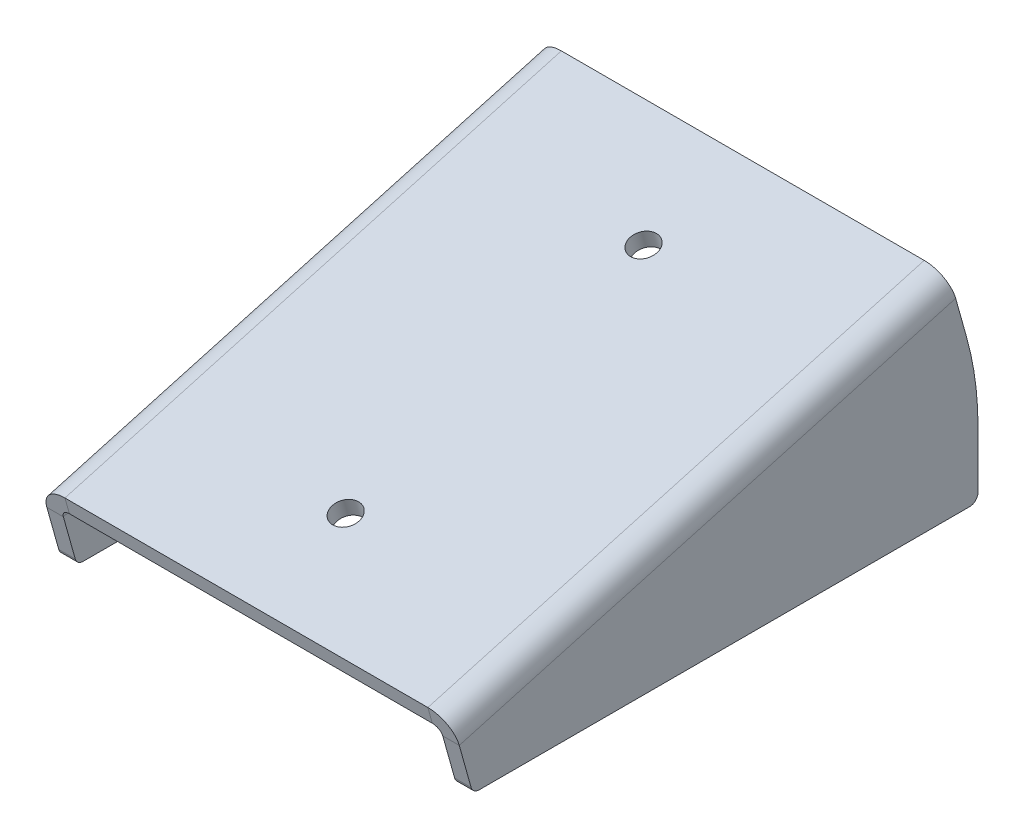
ISO-10303-21;
HEADER;
FILE_DESCRIPTION(('STEP AP214'),'2;1');
FILE_NAME('part.step','',(''),(''),'','','');
FILE_SCHEMA(('AUTOMOTIVE_DESIGN { 1 0 10303 214 1 1 1 1 }'));
ENDSEC;
DATA;
#1=APPLICATION_CONTEXT('core data for automotive mechanical design processes');
#2=APPLICATION_PROTOCOL_DEFINITION('international standard','automotive_design',2000,#1);
#3=PRODUCT_CONTEXT('',#1,'mechanical');
#4=PRODUCT('Part','Part','',(#3));
#5=PRODUCT_RELATED_PRODUCT_CATEGORY('part','',(#4));
#6=PRODUCT_DEFINITION_FORMATION('','',#4);
#7=PRODUCT_DEFINITION_CONTEXT('part definition',#1,'design');
#8=PRODUCT_DEFINITION('design','',#6,#7);
#9=PRODUCT_DEFINITION_SHAPE('','',#8);
#10=(LENGTH_UNIT() NAMED_UNIT(*) SI_UNIT(.MILLI.,.METRE.));
#11=(NAMED_UNIT(*) PLANE_ANGLE_UNIT() SI_UNIT($,.RADIAN.));
#12=(NAMED_UNIT(*) SI_UNIT($,.STERADIAN.) SOLID_ANGLE_UNIT());
#13=UNCERTAINTY_MEASURE_WITH_UNIT(LENGTH_MEASURE(1.E-05),#10,'distance_accuracy_value','');
#14=(GEOMETRIC_REPRESENTATION_CONTEXT(3) GLOBAL_UNCERTAINTY_ASSIGNED_CONTEXT((#13)) GLOBAL_UNIT_ASSIGNED_CONTEXT((#10,
#11,#12)) REPRESENTATION_CONTEXT('',''));
#15=CARTESIAN_POINT('',(0.,0.,0.));
#16=DIRECTION('',(0.,0.,1.));
#17=DIRECTION('',(1.,0.,0.));
#18=AXIS2_PLACEMENT_3D('',#15,#16,#17);
#19=CARTESIAN_POINT('',(50.,13.6740890799414,126.328819016498));
#20=DIRECTION('',(0.,-0.269629925519971,0.962964019714182));
#21=DIRECTION('',(1.,0.,0.));
#22=AXIS2_PLACEMENT_3D('',#19,#20,#21);
#23=PLANE('',#22);
#24=DIRECTION('',(0.,-0.962964019714182,-0.269629925519971));
#25=VECTOR('',#24,1.);
#26=CARTESIAN_POINT('',(44.,13.6740890799414,126.328819016498));
#27=LINE('',#26,#25);
#28=CARTESIAN_POINT('',(44.,17.5259451587981,127.407338718578));
#29=VERTEX_POINT('',#28);
#30=CARTESIAN_POINT('',(44.,13.6740890799414,126.328819016498));
#31=VERTEX_POINT('',#30);
#32=EDGE_CURVE('E290',#29,#31,#27,.T.);
#33=ORIENTED_EDGE('',*,*,#32,.F.);
#34=DIRECTION('',(1.,0.,0.));
#35=VECTOR('',#34,1.);
#36=CARTESIAN_POINT('',(-46.,17.5259451587981,127.407338718578));
#37=LINE('',#36,#35);
#38=CARTESIAN_POINT('',(-44.,17.5259451587981,127.407338718578));
#39=VERTEX_POINT('',#38);
#40=EDGE_CURVE('E260',#39,#29,#37,.T.);
#41=ORIENTED_EDGE('',*,*,#40,.F.);
#42=DIRECTION('',(0.,-0.962964019714182,-0.269629925519971));
#43=VECTOR('',#42,1.);
#44=CARTESIAN_POINT('',(-44.,13.6740890799414,126.328819016498));
#45=LINE('',#44,#43);
#46=CARTESIAN_POINT('',(-44.,13.6740890799414,126.328819016498));
#47=VERTEX_POINT('',#46);
#48=EDGE_CURVE('E288',#39,#47,#45,.T.);
#49=ORIENTED_EDGE('',*,*,#48,.T.);
#50=DIRECTION('',(1.,0.,0.));
#51=VECTOR('',#50,1.);
#52=CARTESIAN_POINT('',(50.,13.6740890799414,126.328819016498));
#53=LINE('',#52,#51);
#54=EDGE_CURVE('E620',#47,#31,#53,.T.);
#55=ORIENTED_EDGE('',*,*,#54,.T.);
#56=EDGE_LOOP('',(#33,#41,#49,#55));
#57=FACE_BOUND('',#56,.T.);
#58=ADVANCED_FACE('F39',(#57),#23,.T.);
#59=CARTESIAN_POINT('',(-44.,11.748161040513,125.789559165458));
#60=DIRECTION('',(0.,-0.26962992551997,0.962964019714182));
#61=DIRECTION('',(0.,-0.962964019714182,-0.26962992551997));
#62=AXIS2_PLACEMENT_3D('',#59,#60,#61);
#63=PLANE('',#62);
#64=ORIENTED_EDGE('',*,*,#48,.F.);
#65=CARTESIAN_POINT('',(-44.,11.748161040513,125.789559165458));
#66=DIRECTION('',(0.,-0.269629925519971,0.962964019714182));
#67=DIRECTION('',(0.,-0.962964019714182,-0.269629925519971));
#68=AXIS2_PLACEMENT_3D('',#65,#66,#67);
#69=CIRCLE('',#68,6.);
#70=CARTESIAN_POINT('',(-50.,11.748161040513,125.789559165458));
#71=VERTEX_POINT('',#70);
#72=EDGE_CURVE('E256',#39,#71,#69,.T.);
#73=ORIENTED_EDGE('',*,*,#72,.T.);
#74=DIRECTION('',(1.,0.,0.));
#75=VECTOR('',#74,1.);
#76=CARTESIAN_POINT('',(-46.,11.748161040513,125.789559165458));
#77=LINE('',#76,#75);
#78=CARTESIAN_POINT('',(-46.,11.748161040513,125.789559165458));
#79=VERTEX_POINT('',#78);
#80=EDGE_CURVE('E285',#71,#79,#77,.T.);
#81=ORIENTED_EDGE('',*,*,#80,.T.);
#82=CARTESIAN_POINT('',(-44.,11.748161040513,125.789559165458));
#83=DIRECTION('',(0.,0.26962992551997,-0.962964019714182));
#84=DIRECTION('',(0.,0.962964019714182,0.26962992551997));
#85=AXIS2_PLACEMENT_3D('',#82,#83,#84);
#86=CIRCLE('',#85,2.);
#87=EDGE_CURVE('E199',#47,#79,#86,.F.);
#88=ORIENTED_EDGE('',*,*,#87,.F.);
#89=EDGE_LOOP('',(#64,#73,#81,#88));
#90=FACE_BOUND('',#89,.T.);
#91=ADVANCED_FACE('F412',(#90),#63,.T.);
#92=CARTESIAN_POINT('',(-46.,17.5259451587981,127.407338718578));
#93=DIRECTION('',(0.,-0.26962992551997,0.962964019714182));
#94=DIRECTION('',(0.,0.962964019714182,0.26962992551997));
#95=AXIS2_PLACEMENT_3D('',#92,#93,#94);
#96=PLANE('',#95);
#97=DIRECTION('',(0.,0.962964019714182,0.26962992551997));
#98=VECTOR('',#97,1.);
#99=CARTESIAN_POINT('',(-50.,17.5259451587981,127.407338718578));
#100=LINE('',#99,#98);
#101=CARTESIAN_POINT('',(-50.,1.46074014896006,122.909081315824));
#102=VERTEX_POINT('',#101);
#103=EDGE_CURVE('E253',#102,#71,#100,.T.);
#104=ORIENTED_EDGE('',*,*,#103,.F.);
#105=DIRECTION('',(1.,0.,0.));
#106=VECTOR('',#105,1.);
#107=CARTESIAN_POINT('',(-46.,1.46074014896006,122.909081315824));
#108=LINE('',#107,#106);
#109=CARTESIAN_POINT('',(-46.,1.46074014896006,122.909081315824));
#110=VERTEX_POINT('',#109);
#111=EDGE_CURVE('E326',#102,#110,#108,.T.);
#112=ORIENTED_EDGE('',*,*,#111,.T.);
#113=DIRECTION('',(0.,0.962964019714182,0.26962992551997));
#114=VECTOR('',#113,1.);
#115=CARTESIAN_POINT('',(-46.,17.5259451587981,127.407338718578));
#116=LINE('',#115,#114);
#117=EDGE_CURVE('E207',#110,#79,#116,.T.);
#118=ORIENTED_EDGE('',*,*,#117,.T.);
#119=ORIENTED_EDGE('',*,*,#80,.F.);
#120=EDGE_LOOP('',(#104,#112,#118,#119));
#121=FACE_BOUND('',#120,.T.);
#122=ADVANCED_FACE('F418',(#121),#96,.T.);
#123=CARTESIAN_POINT('',(-46.,0.,0.));
#124=DIRECTION('',(0.,-1.,0.));
#125=DIRECTION('',(0.,0.,1.));
#126=AXIS2_PLACEMENT_3D('',#123,#124,#125);
#127=PLANE('',#126);
#128=DIRECTION('',(0.,0.,1.));
#129=VECTOR('',#128,1.);
#130=CARTESIAN_POINT('',(-50.,0.,130.879324065148));
#131=LINE('',#130,#129);
#132=CARTESIAN_POINT('',(-50.,0.,2.));
#133=VERTEX_POINT('',#132);
#134=CARTESIAN_POINT('',(-50.,0.,120.983153276395));
#135=VERTEX_POINT('',#134);
#136=EDGE_CURVE('E270',#133,#135,#131,.T.);
#137=ORIENTED_EDGE('',*,*,#136,.F.);
#138=DIRECTION('',(1.,0.,0.));
#139=VECTOR('',#138,1.);
#140=CARTESIAN_POINT('',(-46.,0.,2.));
#141=LINE('',#140,#139);
#142=CARTESIAN_POINT('',(-46.,0.,2.));
#143=VERTEX_POINT('',#142);
#144=EDGE_CURVE('E295',#133,#143,#141,.T.);
#145=ORIENTED_EDGE('',*,*,#144,.T.);
#146=DIRECTION('',(0.,0.,1.));
#147=VECTOR('',#146,1.);
#148=CARTESIAN_POINT('',(-46.,0.,0.));
#149=LINE('',#148,#147);
#150=CARTESIAN_POINT('',(-46.,0.,120.983153276395));
#151=VERTEX_POINT('',#150);
#152=EDGE_CURVE('E367',#143,#151,#149,.T.);
#153=ORIENTED_EDGE('',*,*,#152,.T.);
#154=DIRECTION('',(1.,0.,0.));
#155=VECTOR('',#154,1.);
#156=CARTESIAN_POINT('',(-46.,0.,120.983153276395));
#157=LINE('',#156,#155);
#158=EDGE_CURVE('E292',#151,#135,#157,.F.);
#159=ORIENTED_EDGE('',*,*,#158,.T.);
#160=EDGE_LOOP('',(#137,#145,#153,#159));
#161=FACE_BOUND('',#160,.T.);
#162=ADVANCED_FACE('F455',(#161),#127,.T.);
#163=CARTESIAN_POINT('',(-46.,26.0981277977035,0.));
#164=DIRECTION('',(0.,0.,-1.));
#165=DIRECTION('',(0.,-1.,0.));
#166=AXIS2_PLACEMENT_3D('',#163,#164,#165);
#167=PLANE('',#166);
#168=DIRECTION('',(0.,1.,0.));
#169=VECTOR('',#168,1.);
#170=CARTESIAN_POINT('',(-50.,12.3999476663196,0.));
#171=LINE('',#170,#169);
#172=CARTESIAN_POINT('',(-50.,15.7962352459784,0.));
#173=VERTEX_POINT('',#172);
#174=CARTESIAN_POINT('',(-50.,2.,0.));
#175=VERTEX_POINT('',#174);
#176=EDGE_CURVE('E268',#173,#175,#171,.F.);
#177=ORIENTED_EDGE('',*,*,#176,.F.);
#178=DIRECTION('',(1.,0.,0.));
#179=VECTOR('',#178,1.);
#180=CARTESIAN_POINT('',(-46.,15.7962352459784,0.));
#181=LINE('',#180,#179);
#182=CARTESIAN_POINT('',(-46.,15.7962352459784,0.));
#183=VERTEX_POINT('',#182);
#184=EDGE_CURVE('E331',#173,#183,#181,.T.);
#185=ORIENTED_EDGE('',*,*,#184,.T.);
#186=DIRECTION('',(0.,-1.,0.));
#187=VECTOR('',#186,1.);
#188=CARTESIAN_POINT('',(-46.,26.0981277977035,0.));
#189=LINE('',#188,#187);
#190=CARTESIAN_POINT('',(-46.,2.,0.));
#191=VERTEX_POINT('',#190);
#192=EDGE_CURVE('E362',#183,#191,#189,.T.);
#193=ORIENTED_EDGE('',*,*,#192,.T.);
#194=DIRECTION('',(1.,0.,0.));
#195=VECTOR('',#194,1.);
#196=CARTESIAN_POINT('',(-46.,2.,0.));
#197=LINE('',#196,#195);
#198=EDGE_CURVE('E303',#191,#175,#197,.F.);
#199=ORIENTED_EDGE('',*,*,#198,.T.);
#200=EDGE_LOOP('',(#177,#185,#193,#199));
#201=FACE_BOUND('',#200,.T.);
#202=ADVANCED_FACE('F351',(#201),#167,.T.);
#203=CARTESIAN_POINT('',(-46.,51.2296858487945,7.03683625430547));
#204=DIRECTION('',(0.,0.269629925519971,-0.962964019714182));
#205=DIRECTION('',(0.,-0.962964019714182,-0.269629925519971));
#206=AXIS2_PLACEMENT_3D('',#203,#204,#205);
#207=PLANE('',#206);
#208=DIRECTION('',(0.,-0.962964019714182,-0.269629925519971));
#209=VECTOR('',#208,1.);
#210=CARTESIAN_POINT('',(-46.,51.2296858487945,7.03683625430547));
#211=LINE('',#210,#209);
#212=CARTESIAN_POINT('',(-46.,45.4519017305094,5.41905670118565));
#213=VERTEX_POINT('',#212);
#214=CARTESIAN_POINT('',(-46.,36.0184796599762,2.77769852143637));
#215=VERTEX_POINT('',#214);
#216=EDGE_CURVE('E360',#213,#215,#211,.T.);
#217=ORIENTED_EDGE('',*,*,#216,.T.);
#218=DIRECTION('',(1.,0.,0.));
#219=VECTOR('',#218,1.);
#220=CARTESIAN_POINT('',(-46.,36.0184796599762,2.77769852143637));
#221=LINE('',#220,#219);
#222=CARTESIAN_POINT('',(-50.,36.0184796599762,2.77769852143637));
#223=VERTEX_POINT('',#222);
#224=EDGE_CURVE('E336',#215,#223,#221,.F.);
#225=ORIENTED_EDGE('',*,*,#224,.T.);
#226=DIRECTION('',(0.,-0.962964019714182,-0.269629925519971));
#227=VECTOR('',#226,1.);
#228=CARTESIAN_POINT('',(-50.,51.2296858487945,7.03683625430547));
#229=LINE('',#228,#227);
#230=CARTESIAN_POINT('',(-50.,45.4519017305094,5.41905670118564));
#231=VERTEX_POINT('',#230);
#232=EDGE_CURVE('E265',#231,#223,#229,.T.);
#233=ORIENTED_EDGE('',*,*,#232,.F.);
#234=DIRECTION('',(1.,0.,0.));
#235=VECTOR('',#234,1.);
#236=CARTESIAN_POINT('',(-46.,45.4519017305094,5.41905670118565));
#237=LINE('',#236,#235);
#238=EDGE_CURVE('E283',#231,#213,#237,.T.);
#239=ORIENTED_EDGE('',*,*,#238,.T.);
#240=EDGE_LOOP('',(#217,#225,#233,#239));
#241=FACE_BOUND('',#240,.T.);
#242=ADVANCED_FACE('F364',(#241),#207,.T.);
#243=CARTESIAN_POINT('',(-44.,45.4519017305094,5.41905670118563));
#244=DIRECTION('',(0.,-0.269629925519971,0.962964019714182));
#245=DIRECTION('',(0.,-0.962964019714182,-0.269629925519971));
#246=AXIS2_PLACEMENT_3D('',#243,#244,#245);
#247=PLANE('',#246);
#248=ORIENTED_EDGE('',*,*,#238,.F.);
#249=CARTESIAN_POINT('',(-44.,45.4519017305094,5.41905670118563));
#250=DIRECTION('',(0.,-0.269629925519971,0.962964019714182));
#251=DIRECTION('',(0.,-0.962964019714182,-0.269629925519971));
#252=AXIS2_PLACEMENT_3D('',#249,#250,#251);
#253=CIRCLE('',#252,6.);
#254=CARTESIAN_POINT('',(-44.,51.2296858487945,7.03683625430546));
#255=VERTEX_POINT('',#254);
#256=EDGE_CURVE('E261',#231,#255,#253,.F.);
#257=ORIENTED_EDGE('',*,*,#256,.T.);
#258=DIRECTION('',(0.,-0.962964019714182,-0.269629925519971));
#259=VECTOR('',#258,1.);
#260=CARTESIAN_POINT('',(-44.,47.3778297699377,5.95831655222559));
#261=LINE('',#260,#259);
#262=CARTESIAN_POINT('',(-44.,47.3778297699377,5.95831655222559));
#263=VERTEX_POINT('',#262);
#264=EDGE_CURVE('E281',#255,#263,#261,.T.);
#265=ORIENTED_EDGE('',*,*,#264,.T.);
#266=CARTESIAN_POINT('',(-44.,45.4519017305094,5.41905670118563));
#267=DIRECTION('',(0.,0.269629925519971,-0.962964019714182));
#268=DIRECTION('',(0.,0.962964019714182,0.269629925519971));
#269=AXIS2_PLACEMENT_3D('',#266,#267,#268);
#270=CIRCLE('',#269,2.);
#271=EDGE_CURVE('E227',#213,#263,#270,.T.);
#272=ORIENTED_EDGE('',*,*,#271,.F.);
#273=EDGE_LOOP('',(#248,#257,#265,#272));
#274=FACE_BOUND('',#273,.T.);
#275=ADVANCED_FACE('F467',(#274),#247,.F.);
#276=CARTESIAN_POINT('',(-46.,47.3778297699377,5.95831655222559));
#277=DIRECTION('',(0.,-0.269629925519971,0.962964019714182));
#278=DIRECTION('',(1.,0.,0.));
#279=AXIS2_PLACEMENT_3D('',#276,#277,#278);
#280=PLANE('',#279);
#281=ORIENTED_EDGE('',*,*,#264,.F.);
#282=DIRECTION('',(1.,0.,0.));
#283=VECTOR('',#282,1.);
#284=CARTESIAN_POINT('',(-46.,51.2296858487945,7.03683625430547));
#285=LINE('',#284,#283);
#286=CARTESIAN_POINT('',(44.,51.2296858487945,7.03683625430547));
#287=VERTEX_POINT('',#286);
#288=EDGE_CURVE('E257',#255,#287,#285,.T.);
#289=ORIENTED_EDGE('',*,*,#288,.T.);
#290=DIRECTION('',(0.,-0.962964019714179,-0.269629925519981));
#291=VECTOR('',#290,1.);
#292=CARTESIAN_POINT('',(44.,47.3778297699377,5.95831655222559));
#293=LINE('',#292,#291);
#294=CARTESIAN_POINT('',(44.,47.3778297699377,5.95831655222559));
#295=VERTEX_POINT('',#294);
#296=EDGE_CURVE('E187',#287,#295,#293,.T.);
#297=ORIENTED_EDGE('',*,*,#296,.T.);
#298=DIRECTION('',(1.,0.,0.));
#299=VECTOR('',#298,1.);
#300=CARTESIAN_POINT('',(-46.,47.3778297699377,5.95831655222559));
#301=LINE('',#300,#299);
#302=EDGE_CURVE('E221',#263,#295,#301,.T.);
#303=ORIENTED_EDGE('',*,*,#302,.F.);
#304=EDGE_LOOP('',(#281,#289,#297,#303));
#305=FACE_BOUND('',#304,.T.);
#306=ADVANCED_FACE('F599',(#305),#280,.F.);
#307=CARTESIAN_POINT('',(44.,45.4519017305094,5.41905670118563));
#308=DIRECTION('',(0.,0.269629925519971,-0.962964019714182));
#309=DIRECTION('',(0.,0.962964019714182,0.269629925519971));
#310=AXIS2_PLACEMENT_3D('',#307,#308,#309);
#311=PLANE('',#310);
#312=ORIENTED_EDGE('',*,*,#296,.F.);
#313=CARTESIAN_POINT('',(44.,45.4519017305094,5.41905670118563));
#314=DIRECTION('',(0.,-0.269629925519971,0.962964019714182));
#315=DIRECTION('',(0.,-0.962964019714182,-0.269629925519971));
#316=AXIS2_PLACEMENT_3D('',#313,#314,#315);
#317=CIRCLE('',#316,6.);
#318=CARTESIAN_POINT('',(50.,45.4519017305094,5.41905670118562));
#319=VERTEX_POINT('',#318);
#320=EDGE_CURVE('E182',#287,#319,#317,.F.);
#321=ORIENTED_EDGE('',*,*,#320,.T.);
#322=DIRECTION('',(-1.,0.,0.));
#323=VECTOR('',#322,1.);
#324=CARTESIAN_POINT('',(46.,45.4519017305094,5.41905670118565));
#325=LINE('',#324,#323);
#326=CARTESIAN_POINT('',(46.,45.4519017305094,5.41905670118565));
#327=VERTEX_POINT('',#326);
#328=EDGE_CURVE('E176',#319,#327,#325,.T.);
#329=ORIENTED_EDGE('',*,*,#328,.T.);
#330=CARTESIAN_POINT('',(44.,45.4519017305094,5.41905670118563));
#331=DIRECTION('',(0.,-0.269629925519971,0.962964019714182));
#332=DIRECTION('',(0.,-0.962964019714182,-0.269629925519971));
#333=AXIS2_PLACEMENT_3D('',#330,#331,#332);
#334=CIRCLE('',#333,2.);
#335=EDGE_CURVE('E179',#295,#327,#334,.F.);
#336=ORIENTED_EDGE('',*,*,#335,.F.);
#337=EDGE_LOOP('',(#312,#321,#329,#336));
#338=FACE_BOUND('',#337,.T.);
#339=ADVANCED_FACE('F178',(#338),#311,.T.);
#340=CARTESIAN_POINT('',(46.,47.3778297699377,5.95831655222559));
#341=DIRECTION('',(0.,-0.269629925519971,0.962964019714182));
#342=DIRECTION('',(0.,-0.962964019714182,-0.269629925519971));
#343=AXIS2_PLACEMENT_3D('',#340,#341,#342);
#344=PLANE('',#343);
#345=DIRECTION('',(0.,-0.962964019714182,-0.269629925519971));
#346=VECTOR('',#345,1.);
#347=CARTESIAN_POINT('',(50.,47.3778297699377,5.95831655222559));
#348=LINE('',#347,#346);
#349=CARTESIAN_POINT('',(50.,36.0184796599762,2.77769852143636));
#350=VERTEX_POINT('',#349);
#351=EDGE_CURVE('E251',#319,#350,#348,.T.);
#352=ORIENTED_EDGE('',*,*,#351,.T.);
#353=DIRECTION('',(-1.,0.,0.));
#354=VECTOR('',#353,1.);
#355=CARTESIAN_POINT('',(46.,36.0184796599762,2.77769852143636));
#356=LINE('',#355,#354);
#357=CARTESIAN_POINT('',(46.,36.0184796599762,2.77769852143636));
#358=VERTEX_POINT('',#357);
#359=EDGE_CURVE('E205',#350,#358,#356,.T.);
#360=ORIENTED_EDGE('',*,*,#359,.T.);
#361=DIRECTION('',(0.,-0.962964019714182,-0.269629925519971));
#362=VECTOR('',#361,1.);
#363=CARTESIAN_POINT('',(46.,47.3778297699377,5.95831655222559));
#364=LINE('',#363,#362);
#365=EDGE_CURVE('E202',#327,#358,#364,.T.);
#366=ORIENTED_EDGE('',*,*,#365,.F.);
#367=ORIENTED_EDGE('',*,*,#328,.F.);
#368=EDGE_LOOP('',(#352,#360,#366,#367));
#369=FACE_BOUND('',#368,.T.);
#370=ADVANCED_FACE('F203',(#369),#344,.F.);
#371=CARTESIAN_POINT('',(46.,26.0981277977035,0.));
#372=DIRECTION('',(0.,0.,-1.));
#373=DIRECTION('',(0.,1.,0.));
#374=AXIS2_PLACEMENT_3D('',#371,#372,#373);
#375=PLANE('',#374);
#376=DIRECTION('',(0.,1.,0.));
#377=VECTOR('',#376,1.);
#378=CARTESIAN_POINT('',(46.,26.0981277977035,0.));
#379=LINE('',#378,#377);
#380=CARTESIAN_POINT('',(46.,2.,0.));
#381=VERTEX_POINT('',#380);
#382=CARTESIAN_POINT('',(46.,15.7962352459784,0.));
#383=VERTEX_POINT('',#382);
#384=EDGE_CURVE('E206',#381,#383,#379,.T.);
#385=ORIENTED_EDGE('',*,*,#384,.T.);
#386=DIRECTION('',(1.,0.,0.));
#387=VECTOR('',#386,1.);
#388=CARTESIAN_POINT('',(46.,15.7962352459784,0.));
#389=LINE('',#388,#387);
#390=CARTESIAN_POINT('',(50.,15.7962352459784,0.));
#391=VERTEX_POINT('',#390);
#392=EDGE_CURVE('E47',#383,#391,#389,.T.);
#393=ORIENTED_EDGE('',*,*,#392,.T.);
#394=DIRECTION('',(0.,1.,0.));
#395=VECTOR('',#394,1.);
#396=CARTESIAN_POINT('',(50.,12.3999476663196,0.));
#397=LINE('',#396,#395);
#398=CARTESIAN_POINT('',(50.,2.,0.));
#399=VERTEX_POINT('',#398);
#400=EDGE_CURVE('E249',#399,#391,#397,.T.);
#401=ORIENTED_EDGE('',*,*,#400,.F.);
#402=DIRECTION('',(-1.,0.,0.));
#403=VECTOR('',#402,1.);
#404=CARTESIAN_POINT('',(46.,2.,0.));
#405=LINE('',#404,#403);
#406=EDGE_CURVE('E310',#399,#381,#405,.T.);
#407=ORIENTED_EDGE('',*,*,#406,.T.);
#408=EDGE_LOOP('',(#385,#393,#401,#407));
#409=FACE_BOUND('',#408,.T.);
#410=ADVANCED_FACE('F385',(#409),#375,.T.);
#411=CARTESIAN_POINT('',(46.,0.,0.));
#412=DIRECTION('',(0.,-1.,0.));
#413=DIRECTION('',(0.,0.,-1.));
#414=AXIS2_PLACEMENT_3D('',#411,#412,#413);
#415=PLANE('',#414);
#416=DIRECTION('',(0.,0.,-1.));
#417=VECTOR('',#416,1.);
#418=CARTESIAN_POINT('',(46.,0.,0.));
#419=LINE('',#418,#417);
#420=CARTESIAN_POINT('',(46.,0.,120.983153276395));
#421=VERTEX_POINT('',#420);
#422=CARTESIAN_POINT('',(46.,0.,2.));
#423=VERTEX_POINT('',#422);
#424=EDGE_CURVE('E216',#421,#423,#419,.T.);
#425=ORIENTED_EDGE('',*,*,#424,.T.);
#426=DIRECTION('',(-1.,0.,0.));
#427=VECTOR('',#426,1.);
#428=CARTESIAN_POINT('',(46.,0.,2.));
#429=LINE('',#428,#427);
#430=CARTESIAN_POINT('',(50.,0.,2.));
#431=VERTEX_POINT('',#430);
#432=EDGE_CURVE('E320',#423,#431,#429,.F.);
#433=ORIENTED_EDGE('',*,*,#432,.T.);
#434=DIRECTION('',(0.,0.,1.));
#435=VECTOR('',#434,1.);
#436=CARTESIAN_POINT('',(50.,0.,130.879324065148));
#437=LINE('',#436,#435);
#438=CARTESIAN_POINT('',(50.,0.,120.983153276395));
#439=VERTEX_POINT('',#438);
#440=EDGE_CURVE('E246',#439,#431,#437,.F.);
#441=ORIENTED_EDGE('',*,*,#440,.F.);
#442=DIRECTION('',(-1.,0.,0.));
#443=VECTOR('',#442,1.);
#444=CARTESIAN_POINT('',(46.,0.,120.983153276395));
#445=LINE('',#444,#443);
#446=EDGE_CURVE('E317',#439,#421,#445,.T.);
#447=ORIENTED_EDGE('',*,*,#446,.T.);
#448=EDGE_LOOP('',(#425,#433,#441,#447));
#449=FACE_BOUND('',#448,.T.);
#450=ADVANCED_FACE('F375',(#449),#415,.T.);
#451=CARTESIAN_POINT('',(46.,17.5259451587981,127.407338718578));
#452=DIRECTION('',(0.,-0.26962992551997,0.962964019714182));
#453=DIRECTION('',(0.,-0.962964019714182,-0.26962992551997));
#454=AXIS2_PLACEMENT_3D('',#451,#452,#453);
#455=PLANE('',#454);
#456=DIRECTION('',(0.,-0.962964019714182,-0.26962992551997));
#457=VECTOR('',#456,1.);
#458=CARTESIAN_POINT('',(46.,17.5259451587981,127.407338718578));
#459=LINE('',#458,#457);
#460=CARTESIAN_POINT('',(46.,11.748161040513,125.789559165458));
#461=VERTEX_POINT('',#460);
#462=CARTESIAN_POINT('',(46.,1.46074014896005,122.909081315824));
#463=VERTEX_POINT('',#462);
#464=EDGE_CURVE('E212',#461,#463,#459,.T.);
#465=ORIENTED_EDGE('',*,*,#464,.T.);
#466=DIRECTION('',(-1.,0.,0.));
#467=VECTOR('',#466,1.);
#468=CARTESIAN_POINT('',(46.,1.46074014896005,122.909081315824));
#469=LINE('',#468,#467);
#470=CARTESIAN_POINT('',(50.,1.46074014896005,122.909081315824));
#471=VERTEX_POINT('',#470);
#472=EDGE_CURVE('E329',#463,#471,#469,.F.);
#473=ORIENTED_EDGE('',*,*,#472,.T.);
#474=DIRECTION('',(0.,-0.962964019714182,-0.26962992551997));
#475=VECTOR('',#474,1.);
#476=CARTESIAN_POINT('',(50.,17.5259451587981,127.407338718578));
#477=LINE('',#476,#475);
#478=CARTESIAN_POINT('',(50.,11.748161040513,125.789559165458));
#479=VERTEX_POINT('',#478);
#480=EDGE_CURVE('E236',#479,#471,#477,.T.);
#481=ORIENTED_EDGE('',*,*,#480,.F.);
#482=DIRECTION('',(-1.,0.,0.));
#483=VECTOR('',#482,1.);
#484=CARTESIAN_POINT('',(46.,11.748161040513,125.789559165458));
#485=LINE('',#484,#483);
#486=EDGE_CURVE('E188',#479,#461,#485,.T.);
#487=ORIENTED_EDGE('',*,*,#486,.T.);
#488=EDGE_LOOP('',(#465,#473,#481,#487));
#489=FACE_BOUND('',#488,.T.);
#490=ADVANCED_FACE('F397',(#489),#455,.T.);
#491=CARTESIAN_POINT('',(44.,11.748161040513,125.789559165458));
#492=DIRECTION('',(0.,-0.26962992551997,0.962964019714182));
#493=DIRECTION('',(0.,-0.962964019714182,-0.26962992551997));
#494=AXIS2_PLACEMENT_3D('',#491,#492,#493);
#495=PLANE('',#494);
#496=CARTESIAN_POINT('',(44.,11.748161040513,125.789559165458));
#497=DIRECTION('',(0.,-0.269629925519971,0.962964019714182));
#498=DIRECTION('',(0.,-0.962964019714182,-0.269629925519971));
#499=AXIS2_PLACEMENT_3D('',#496,#497,#498);
#500=CIRCLE('',#499,6.);
#501=EDGE_CURVE('E255',#479,#29,#500,.T.);
#502=ORIENTED_EDGE('',*,*,#501,.T.);
#503=ORIENTED_EDGE('',*,*,#32,.T.);
#504=CARTESIAN_POINT('',(44.,11.748161040513,125.789559165458));
#505=DIRECTION('',(0.,0.26962992551997,-0.962964019714182));
#506=DIRECTION('',(0.,0.962964019714182,0.26962992551997));
#507=AXIS2_PLACEMENT_3D('',#504,#505,#506);
#508=CIRCLE('',#507,2.);
#509=EDGE_CURVE('E198',#461,#31,#508,.F.);
#510=ORIENTED_EDGE('',*,*,#509,.F.);
#511=ORIENTED_EDGE('',*,*,#486,.F.);
#512=EDGE_LOOP('',(#502,#503,#510,#511));
#513=FACE_BOUND('',#512,.T.);
#514=ADVANCED_FACE('F423',(#513),#495,.T.);
#515=CARTESIAN_POINT('',(46.,12.3999476663196,130.879324065148));
#516=DIRECTION('',(1.,0.,0.));
#517=DIRECTION('',(0.,1.,0.));
#518=AXIS2_PLACEMENT_3D('',#515,#516,#517);
#519=PLANE('',#518);
#520=ORIENTED_EDGE('',*,*,#365,.T.);
#521=CARTESIAN_POINT('',(46.,15.7962352459784,75.));
#522=DIRECTION('',(1.,0.,0.));
#523=DIRECTION('',(0.,1.,0.));
#524=AXIS2_PLACEMENT_3D('',#521,#522,#523);
#525=CIRCLE('',#524,75.);
#526=EDGE_CURVE('E61',#358,#383,#525,.F.);
#527=ORIENTED_EDGE('',*,*,#526,.T.);
#528=ORIENTED_EDGE('',*,*,#384,.F.);
#529=CARTESIAN_POINT('',(46.,2.,2.));
#530=DIRECTION('',(1.,0.,0.));
#531=DIRECTION('',(0.,1.,0.));
#532=AXIS2_PLACEMENT_3D('',#529,#530,#531);
#533=CIRCLE('',#532,2.);
#534=EDGE_CURVE('E315',#381,#423,#533,.F.);
#535=ORIENTED_EDGE('',*,*,#534,.T.);
#536=ORIENTED_EDGE('',*,*,#424,.F.);
#537=CARTESIAN_POINT('',(46.,2.,120.983153276395));
#538=DIRECTION('',(1.,0.,0.));
#539=DIRECTION('',(0.,1.,0.));
#540=AXIS2_PLACEMENT_3D('',#537,#538,#539);
#541=CIRCLE('',#540,2.);
#542=EDGE_CURVE('E313',#421,#463,#541,.F.);
#543=ORIENTED_EDGE('',*,*,#542,.T.);
#544=ORIENTED_EDGE('',*,*,#464,.F.);
#545=DIRECTION('',(0.,0.269629925519971,-0.962964019714182));
#546=VECTOR('',#545,1.);
#547=CARTESIAN_POINT('',(46.,45.4519017305094,5.41905670118563));
#548=LINE('',#547,#546);
#549=EDGE_CURVE('E195',#461,#327,#548,.T.);
#550=ORIENTED_EDGE('',*,*,#549,.T.);
#551=EDGE_LOOP('',(#520,#527,#528,#535,#536,#543,#544,#550));
#552=FACE_BOUND('',#551,.T.);
#553=ADVANCED_FACE('F210',(#552),#519,.F.);
#554=CARTESIAN_POINT('',(-46.,12.3999476663196,130.879324065148));
#555=DIRECTION('',(-1.,0.,0.));
#556=DIRECTION('',(0.,0.,1.));
#557=AXIS2_PLACEMENT_3D('',#554,#555,#556);
#558=PLANE('',#557);
#559=ORIENTED_EDGE('',*,*,#192,.F.);
#560=CARTESIAN_POINT('',(-46.,15.7962352459784,75.));
#561=DIRECTION('',(-1.,0.,0.));
#562=DIRECTION('',(0.,0.,1.));
#563=AXIS2_PLACEMENT_3D('',#560,#561,#562);
#564=CIRCLE('',#563,75.);
#565=EDGE_CURVE('E334',#183,#215,#564,.F.);
#566=ORIENTED_EDGE('',*,*,#565,.T.);
#567=ORIENTED_EDGE('',*,*,#216,.F.);
#568=DIRECTION('',(0.,0.269629925519971,-0.962964019714182));
#569=VECTOR('',#568,1.);
#570=CARTESIAN_POINT('',(-46.,11.748161040513,125.789559165458));
#571=LINE('',#570,#569);
#572=EDGE_CURVE('E224',#213,#79,#571,.F.);
#573=ORIENTED_EDGE('',*,*,#572,.T.);
#574=ORIENTED_EDGE('',*,*,#117,.F.);
#575=CARTESIAN_POINT('',(-46.,2.,120.983153276395));
#576=DIRECTION('',(-1.,0.,0.));
#577=DIRECTION('',(0.,0.,1.));
#578=AXIS2_PLACEMENT_3D('',#575,#576,#577);
#579=CIRCLE('',#578,2.);
#580=EDGE_CURVE('E298',#110,#151,#579,.F.);
#581=ORIENTED_EDGE('',*,*,#580,.T.);
#582=ORIENTED_EDGE('',*,*,#152,.F.);
#583=CARTESIAN_POINT('',(-46.,2.,2.));
#584=DIRECTION('',(-1.,0.,0.));
#585=DIRECTION('',(0.,0.,1.));
#586=AXIS2_PLACEMENT_3D('',#583,#584,#585);
#587=CIRCLE('',#586,2.);
#588=EDGE_CURVE('E300',#143,#191,#587,.F.);
#589=ORIENTED_EDGE('',*,*,#588,.T.);
#590=EDGE_LOOP('',(#559,#566,#567,#573,#574,#581,#582,#589));
#591=FACE_BOUND('',#590,.T.);
#592=ADVANCED_FACE('F359',(#591),#558,.F.);
#593=CARTESIAN_POINT('',(-46.,12.3999476663196,130.879324065148));
#594=DIRECTION('',(0.,0.962964019714182,0.269629925519971));
#595=DIRECTION('',(0.,-0.269629925519971,0.962964019714182));
#596=AXIS2_PLACEMENT_3D('',#593,#594,#595);
#597=PLANE('',#596);
#598=CARTESIAN_POINT('',(0.,20.4148372179407,102.254718523644));
#599=DIRECTION('',(0.,-0.962964019714182,-0.269629925519971));
#600=DIRECTION('',(0.,0.269629925519971,-0.962964019714182));
#601=AXIS2_PLACEMENT_3D('',#598,#599,#600);
#602=CIRCLE('',#601,3.24999999999999);
#603=CARTESIAN_POINT('',(0.,21.2911344758806,99.1250854595727));
#604=VERTEX_POINT('',#603);
#605=EDGE_CURVE('E633',#604,#604,#602,.T.);
#606=ORIENTED_EDGE('',*,*,#605,.F.);
#607=EDGE_LOOP('',(#606));
#608=FACE_BOUND('',#607,.T.);
#609=CARTESIAN_POINT('',(0.,40.6370816319385,30.0324170450801));
#610=DIRECTION('',(0.,-0.962964019714182,-0.269629925519971));
#611=DIRECTION('',(0.,0.269629925519971,-0.962964019714182));
#612=AXIS2_PLACEMENT_3D('',#609,#610,#611);
#613=CIRCLE('',#612,3.24999999999999);
#614=CARTESIAN_POINT('',(0.,41.5133788898784,26.902783981009));
#615=VERTEX_POINT('',#614);
#616=EDGE_CURVE('E628',#615,#615,#613,.T.);
#617=ORIENTED_EDGE('',*,*,#616,.F.);
#618=EDGE_LOOP('',(#617));
#619=FACE_BOUND('',#618,.T.);
#620=ORIENTED_EDGE('',*,*,#54,.F.);
#621=DIRECTION('',(0.,0.269629925519971,-0.962964019714182));
#622=VECTOR('',#621,1.);
#623=CARTESIAN_POINT('',(-44.,47.3778297699378,5.95831655222557));
#624=LINE('',#623,#622);
#625=EDGE_CURVE('E214',#47,#263,#624,.T.);
#626=ORIENTED_EDGE('',*,*,#625,.T.);
#627=ORIENTED_EDGE('',*,*,#302,.T.);
#628=DIRECTION('',(0.,0.269629925519971,-0.962964019714182));
#629=VECTOR('',#628,1.);
#630=CARTESIAN_POINT('',(44.,13.6740890799414,126.328819016498));
#631=LINE('',#630,#629);
#632=EDGE_CURVE('E197',#295,#31,#631,.F.);
#633=ORIENTED_EDGE('',*,*,#632,.T.);
#634=EDGE_LOOP('',(#620,#626,#627,#633));
#635=FACE_BOUND('',#634,.T.);
#636=ADVANCED_FACE('F511',(#608,#619,#635),#597,.F.);
#637=CARTESIAN_POINT('',(44.,10.4740196268912,130.340064214108));
#638=DIRECTION('',(0.,-0.269629925519971,0.962964019714182));
#639=DIRECTION('',(0.,-0.962964019714182,-0.269629925519971));
#640=AXIS2_PLACEMENT_3D('',#637,#638,#639);
#641=CYLINDRICAL_SURFACE('',#640,2.);
#642=ORIENTED_EDGE('',*,*,#509,.T.);
#643=ORIENTED_EDGE('',*,*,#632,.F.);
#644=ORIENTED_EDGE('',*,*,#335,.T.);
#645=ORIENTED_EDGE('',*,*,#549,.F.);
#646=EDGE_LOOP('',(#642,#643,#644,#645));
#647=FACE_BOUND('',#646,.T.);
#648=ADVANCED_FACE('F193',(#647),#641,.F.);
#649=CARTESIAN_POINT('',(-44.,10.4740196268912,130.340064214108));
#650=DIRECTION('',(0.,-0.269629925519971,0.962964019714182));
#651=DIRECTION('',(0.,-0.962964019714182,-0.269629925519971));
#652=AXIS2_PLACEMENT_3D('',#649,#650,#651);
#653=CYLINDRICAL_SURFACE('',#652,2.);
#654=ORIENTED_EDGE('',*,*,#87,.T.);
#655=ORIENTED_EDGE('',*,*,#572,.F.);
#656=ORIENTED_EDGE('',*,*,#271,.T.);
#657=ORIENTED_EDGE('',*,*,#625,.F.);
#658=EDGE_LOOP('',(#654,#655,#656,#657));
#659=FACE_BOUND('',#658,.T.);
#660=ADVANCED_FACE('F523',(#659),#653,.F.);
#661=CARTESIAN_POINT('',(50.,12.3999476663196,130.879324065148));
#662=DIRECTION('',(1.,0.,0.));
#663=DIRECTION('',(0.,1.,0.));
#664=AXIS2_PLACEMENT_3D('',#661,#662,#663);
#665=PLANE('',#664);
#666=ORIENTED_EDGE('',*,*,#400,.T.);
#667=CARTESIAN_POINT('',(50.,15.7962352459784,75.));
#668=DIRECTION('',(1.,0.,0.));
#669=DIRECTION('',(0.,1.,0.));
#670=AXIS2_PLACEMENT_3D('',#667,#668,#669);
#671=CIRCLE('',#670,75.);
#672=EDGE_CURVE('E11',#391,#350,#671,.T.);
#673=ORIENTED_EDGE('',*,*,#672,.T.);
#674=ORIENTED_EDGE('',*,*,#351,.F.);
#675=DIRECTION('',(0.,-0.269629925519971,0.962964019714182));
#676=VECTOR('',#675,1.);
#677=CARTESIAN_POINT('',(50.,10.4740196268912,130.340064214108));
#678=LINE('',#677,#676);
#679=EDGE_CURVE('E233',#479,#319,#678,.F.);
#680=ORIENTED_EDGE('',*,*,#679,.F.);
#681=ORIENTED_EDGE('',*,*,#480,.T.);
#682=CARTESIAN_POINT('',(50.,2.,120.983153276395));
#683=DIRECTION('',(1.,0.,0.));
#684=DIRECTION('',(0.,1.,0.));
#685=AXIS2_PLACEMENT_3D('',#682,#683,#684);
#686=CIRCLE('',#685,2.);
#687=EDGE_CURVE('E322',#471,#439,#686,.T.);
#688=ORIENTED_EDGE('',*,*,#687,.T.);
#689=ORIENTED_EDGE('',*,*,#440,.T.);
#690=CARTESIAN_POINT('',(50.,2.,2.));
#691=DIRECTION('',(1.,0.,0.));
#692=DIRECTION('',(0.,1.,0.));
#693=AXIS2_PLACEMENT_3D('',#690,#691,#692);
#694=CIRCLE('',#693,2.);
#695=EDGE_CURVE('E324',#431,#399,#694,.T.);
#696=ORIENTED_EDGE('',*,*,#695,.T.);
#697=EDGE_LOOP('',(#666,#673,#674,#680,#681,#688,#689,#696));
#698=FACE_BOUND('',#697,.T.);
#699=ADVANCED_FACE('F383',(#698),#665,.T.);
#700=CARTESIAN_POINT('',(-50.,12.3999476663196,130.879324065148));
#701=DIRECTION('',(-1.,0.,0.));
#702=DIRECTION('',(0.,0.,1.));
#703=AXIS2_PLACEMENT_3D('',#700,#701,#702);
#704=PLANE('',#703);
#705=ORIENTED_EDGE('',*,*,#232,.T.);
#706=CARTESIAN_POINT('',(-50.,15.7962352459784,75.));
#707=DIRECTION('',(-1.,0.,0.));
#708=DIRECTION('',(0.,0.,1.));
#709=AXIS2_PLACEMENT_3D('',#706,#707,#708);
#710=CIRCLE('',#709,75.);
#711=EDGE_CURVE('E338',#223,#173,#710,.T.);
#712=ORIENTED_EDGE('',*,*,#711,.T.);
#713=ORIENTED_EDGE('',*,*,#176,.T.);
#714=CARTESIAN_POINT('',(-50.,2.,2.));
#715=DIRECTION('',(-1.,0.,0.));
#716=DIRECTION('',(0.,0.,1.));
#717=AXIS2_PLACEMENT_3D('',#714,#715,#716);
#718=CIRCLE('',#717,2.);
#719=EDGE_CURVE('E308',#175,#133,#718,.T.);
#720=ORIENTED_EDGE('',*,*,#719,.T.);
#721=ORIENTED_EDGE('',*,*,#136,.T.);
#722=CARTESIAN_POINT('',(-50.,2.,120.983153276395));
#723=DIRECTION('',(-1.,0.,0.));
#724=DIRECTION('',(0.,0.,1.));
#725=AXIS2_PLACEMENT_3D('',#722,#723,#724);
#726=CIRCLE('',#725,2.);
#727=EDGE_CURVE('E306',#135,#102,#726,.T.);
#728=ORIENTED_EDGE('',*,*,#727,.T.);
#729=ORIENTED_EDGE('',*,*,#103,.T.);
#730=DIRECTION('',(0.,-0.269629925519971,0.962964019714182));
#731=VECTOR('',#730,1.);
#732=CARTESIAN_POINT('',(-50.,10.4740196268912,130.340064214108));
#733=LINE('',#732,#731);
#734=EDGE_CURVE('E230',#231,#71,#733,.T.);
#735=ORIENTED_EDGE('',*,*,#734,.F.);
#736=EDGE_LOOP('',(#705,#712,#713,#720,#721,#728,#729,#735));
#737=FACE_BOUND('',#736,.T.);
#738=ADVANCED_FACE('F344',(#737),#704,.T.);
#739=CARTESIAN_POINT('',(-46.,16.2518037451763,131.957843767228));
#740=DIRECTION('',(0.,0.962964019714182,0.269629925519971));
#741=DIRECTION('',(0.,-0.269629925519971,0.962964019714182));
#742=AXIS2_PLACEMENT_3D('',#739,#740,#741);
#743=PLANE('',#742);
#744=CARTESIAN_POINT('',(0.,24.2666932967974,103.333238225724));
#745=DIRECTION('',(0.,0.962964019714182,0.269629925519971));
#746=DIRECTION('',(0.,-0.269629925519971,0.962964019714182));
#747=AXIS2_PLACEMENT_3D('',#744,#745,#746);
#748=CIRCLE('',#747,3.24999999999999);
#749=CARTESIAN_POINT('',(0.,25.1429905547373,100.203605161653));
#750=VERTEX_POINT('',#749);
#751=EDGE_CURVE('E631',#750,#750,#748,.T.);
#752=ORIENTED_EDGE('',*,*,#751,.F.);
#753=EDGE_LOOP('',(#752));
#754=FACE_BOUND('',#753,.T.);
#755=CARTESIAN_POINT('',(0.,44.4889377107952,31.11093674716));
#756=DIRECTION('',(0.,0.962964019714182,0.269629925519971));
#757=DIRECTION('',(0.,-0.269629925519971,0.962964019714182));
#758=AXIS2_PLACEMENT_3D('',#755,#756,#757);
#759=CIRCLE('',#758,3.24999999999999);
#760=CARTESIAN_POINT('',(0.,45.3652349687351,27.9813036830889));
#761=VERTEX_POINT('',#760);
#762=EDGE_CURVE('E264',#761,#761,#759,.T.);
#763=ORIENTED_EDGE('',*,*,#762,.F.);
#764=EDGE_LOOP('',(#763));
#765=FACE_BOUND('',#764,.T.);
#766=ORIENTED_EDGE('',*,*,#40,.T.);
#767=DIRECTION('',(0.,-0.269629925519971,0.962964019714182));
#768=VECTOR('',#767,1.);
#769=CARTESIAN_POINT('',(44.,16.2518037451763,131.957843767228));
#770=LINE('',#769,#768);
#771=EDGE_CURVE('E235',#287,#29,#770,.T.);
#772=ORIENTED_EDGE('',*,*,#771,.F.);
#773=ORIENTED_EDGE('',*,*,#288,.F.);
#774=DIRECTION('',(0.,-0.269629925519971,0.962964019714182));
#775=VECTOR('',#774,1.);
#776=CARTESIAN_POINT('',(-44.,16.2518037451763,131.957843767228));
#777=LINE('',#776,#775);
#778=EDGE_CURVE('E239',#39,#255,#777,.F.);
#779=ORIENTED_EDGE('',*,*,#778,.F.);
#780=EDGE_LOOP('',(#766,#772,#773,#779));
#781=FACE_BOUND('',#780,.T.);
#782=ADVANCED_FACE('F535',(#754,#765,#781),#743,.T.);
#783=CARTESIAN_POINT('',(44.,10.4740196268912,130.340064214108));
#784=DIRECTION('',(0.,-0.269629925519971,0.962964019714182));
#785=DIRECTION('',(0.,-0.962964019714182,-0.269629925519971));
#786=AXIS2_PLACEMENT_3D('',#783,#784,#785);
#787=CYLINDRICAL_SURFACE('',#786,6.);
#788=ORIENTED_EDGE('',*,*,#501,.F.);
#789=ORIENTED_EDGE('',*,*,#679,.T.);
#790=ORIENTED_EDGE('',*,*,#320,.F.);
#791=ORIENTED_EDGE('',*,*,#771,.T.);
#792=EDGE_LOOP('',(#788,#789,#790,#791));
#793=FACE_BOUND('',#792,.T.);
#794=ADVANCED_FACE('F393',(#793),#787,.T.);
#795=CARTESIAN_POINT('',(-44.,10.4740196268912,130.340064214108));
#796=DIRECTION('',(0.,-0.269629925519971,0.962964019714182));
#797=DIRECTION('',(0.,-0.962964019714182,-0.269629925519971));
#798=AXIS2_PLACEMENT_3D('',#795,#796,#797);
#799=CYLINDRICAL_SURFACE('',#798,6.);
#800=ORIENTED_EDGE('',*,*,#72,.F.);
#801=ORIENTED_EDGE('',*,*,#778,.T.);
#802=ORIENTED_EDGE('',*,*,#256,.F.);
#803=ORIENTED_EDGE('',*,*,#734,.T.);
#804=EDGE_LOOP('',(#800,#801,#802,#803));
#805=FACE_BOUND('',#804,.T.);
#806=ADVANCED_FACE('F429',(#805),#799,.T.);
#807=CARTESIAN_POINT('',(-46.,2.,2.));
#808=DIRECTION('',(1.,0.,0.));
#809=DIRECTION('',(0.,0.,-1.));
#810=AXIS2_PLACEMENT_3D('',#807,#808,#809);
#811=CYLINDRICAL_SURFACE('',#810,2.);
#812=ORIENTED_EDGE('',*,*,#719,.F.);
#813=ORIENTED_EDGE('',*,*,#198,.F.);
#814=ORIENTED_EDGE('',*,*,#588,.F.);
#815=ORIENTED_EDGE('',*,*,#144,.F.);
#816=EDGE_LOOP('',(#812,#813,#814,#815));
#817=FACE_BOUND('',#816,.T.);
#818=ADVANCED_FACE('F426',(#817),#811,.T.);
#819=CARTESIAN_POINT('',(46.,2.,2.));
#820=DIRECTION('',(-1.,0.,0.));
#821=DIRECTION('',(0.,-1.,0.));
#822=AXIS2_PLACEMENT_3D('',#819,#820,#821);
#823=CYLINDRICAL_SURFACE('',#822,2.);
#824=ORIENTED_EDGE('',*,*,#695,.F.);
#825=ORIENTED_EDGE('',*,*,#432,.F.);
#826=ORIENTED_EDGE('',*,*,#534,.F.);
#827=ORIENTED_EDGE('',*,*,#406,.F.);
#828=EDGE_LOOP('',(#824,#825,#826,#827));
#829=FACE_BOUND('',#828,.T.);
#830=ADVANCED_FACE('F380',(#829),#823,.T.);
#831=CARTESIAN_POINT('',(-46.,2.,120.983153276395));
#832=DIRECTION('',(1.,0.,0.));
#833=DIRECTION('',(0.,0.,-1.));
#834=AXIS2_PLACEMENT_3D('',#831,#832,#833);
#835=CYLINDRICAL_SURFACE('',#834,2.);
#836=ORIENTED_EDGE('',*,*,#727,.F.);
#837=ORIENTED_EDGE('',*,*,#158,.F.);
#838=ORIENTED_EDGE('',*,*,#580,.F.);
#839=ORIENTED_EDGE('',*,*,#111,.F.);
#840=EDGE_LOOP('',(#836,#837,#838,#839));
#841=FACE_BOUND('',#840,.T.);
#842=ADVANCED_FACE('F403',(#841),#835,.T.);
#843=CARTESIAN_POINT('',(46.,2.,120.983153276395));
#844=DIRECTION('',(-1.,0.,0.));
#845=DIRECTION('',(0.,-1.,0.));
#846=AXIS2_PLACEMENT_3D('',#843,#844,#845);
#847=CYLINDRICAL_SURFACE('',#846,2.);
#848=ORIENTED_EDGE('',*,*,#687,.F.);
#849=ORIENTED_EDGE('',*,*,#472,.F.);
#850=ORIENTED_EDGE('',*,*,#542,.F.);
#851=ORIENTED_EDGE('',*,*,#446,.F.);
#852=EDGE_LOOP('',(#848,#849,#850,#851));
#853=FACE_BOUND('',#852,.T.);
#854=ADVANCED_FACE('F401',(#853),#847,.T.);
#855=CARTESIAN_POINT('',(-46.,15.7962352459784,75.));
#856=DIRECTION('',(1.,0.,0.));
#857=DIRECTION('',(0.,0.,-1.));
#858=AXIS2_PLACEMENT_3D('',#855,#856,#857);
#859=CYLINDRICAL_SURFACE('',#858,75.);
#860=ORIENTED_EDGE('',*,*,#711,.F.);
#861=ORIENTED_EDGE('',*,*,#224,.F.);
#862=ORIENTED_EDGE('',*,*,#565,.F.);
#863=ORIENTED_EDGE('',*,*,#184,.F.);
#864=EDGE_LOOP('',(#860,#861,#862,#863));
#865=FACE_BOUND('',#864,.T.);
#866=ADVANCED_FACE('F355',(#865),#859,.T.);
#867=CARTESIAN_POINT('',(46.,15.7962352459784,75.));
#868=DIRECTION('',(1.,0.,0.));
#869=DIRECTION('',(0.,1.,0.));
#870=AXIS2_PLACEMENT_3D('',#867,#868,#869);
#871=CYLINDRICAL_SURFACE('',#870,75.);
#872=ORIENTED_EDGE('',*,*,#672,.F.);
#873=ORIENTED_EDGE('',*,*,#392,.F.);
#874=ORIENTED_EDGE('',*,*,#526,.F.);
#875=ORIENTED_EDGE('',*,*,#359,.F.);
#876=EDGE_LOOP('',(#872,#873,#874,#875));
#877=FACE_BOUND('',#876,.T.);
#878=ADVANCED_FACE('F41',(#877),#871,.T.);
#879=CARTESIAN_POINT('',(0.,40.6370816319385,30.0324170450801));
#880=DIRECTION('',(0.,-0.962964019714182,-0.269629925519971));
#881=DIRECTION('',(0.,0.269629925519971,-0.962964019714182));
#882=AXIS2_PLACEMENT_3D('',#879,#880,#881);
#883=CYLINDRICAL_SURFACE('',#882,3.24999999999999);
#884=CARTESIAN_POINT('',(0.,45.3652349687351,27.9813036830889));
#885=CARTESIAN_POINT('',(0.,45.3251114679137,27.9700691028589));
#886=CARTESIAN_POINT('',(0.,45.2849879670923,27.9588345226289));
#887=CARTESIAN_POINT('',(0.,45.2047409654494,27.9363653621689));
#888=CARTESIAN_POINT('',(0.,45.164617464628,27.9251307819389));
#889=CARTESIAN_POINT('',(0.,45.0843704629851,27.9026616214789));
#890=CARTESIAN_POINT('',(0.,45.0442469621637,27.8914270412489));
#891=CARTESIAN_POINT('',(0.,44.9639999605209,27.8689578807889));
#892=CARTESIAN_POINT('',(0.,44.9238764596994,27.8577233005589));
#893=CARTESIAN_POINT('',(0.,44.8436294580566,27.8352541400989));
#894=CARTESIAN_POINT('',(0.,44.8035059572352,27.8240195598689));
#895=CARTESIAN_POINT('',(0.,44.7232589555923,27.8015503994089));
#896=CARTESIAN_POINT('',(0.,44.6831354547709,27.7903158191789));
#897=CARTESIAN_POINT('',(0.,44.6028884531281,27.7678466587189));
#898=CARTESIAN_POINT('',(0.,44.5627649523066,27.7566120784889));
#899=CARTESIAN_POINT('',(0.,44.4825179506638,27.7341429180289));
#900=CARTESIAN_POINT('',(0.,44.4423944498424,27.7229083377989));
#901=CARTESIAN_POINT('',(0.,44.3621474481995,27.7004391773389));
#902=CARTESIAN_POINT('',(0.,44.3220239473781,27.6892045971089));
#903=CARTESIAN_POINT('',(0.,44.2417769457352,27.6667354366489));
#904=CARTESIAN_POINT('',(0.,44.2016534449138,27.6555008564189));
#905=CARTESIAN_POINT('',(0.,44.121406443271,27.6330316959589));
#906=CARTESIAN_POINT('',(0.,44.0812829424495,27.6217971157289));
#907=CARTESIAN_POINT('',(0.,44.0010359408067,27.599327955269));
#908=CARTESIAN_POINT('',(0.,43.9609124399853,27.5880933750389));
#909=CARTESIAN_POINT('',(0.,43.8806654383424,27.565624214579));
#910=CARTESIAN_POINT('',(0.,43.840541937521,27.554389634349));
#911=CARTESIAN_POINT('',(0.,43.7602949358782,27.531920473889));
#912=CARTESIAN_POINT('',(0.,43.7201714350567,27.520685893659));
#913=CARTESIAN_POINT('',(0.,43.6399244334139,27.498216733199));
#914=CARTESIAN_POINT('',(0.,43.5998009325925,27.486982152969));
#915=CARTESIAN_POINT('',(0.,43.5195539309496,27.464512992509));
#916=CARTESIAN_POINT('',(0.,43.4794304301282,27.453278412279));
#917=CARTESIAN_POINT('',(0.,43.3991834284853,27.430809251819));
#918=CARTESIAN_POINT('',(0.,43.3590599276639,27.419574671589));
#919=CARTESIAN_POINT('',(0.,43.2788129260211,27.397105511129));
#920=CARTESIAN_POINT('',(0.,43.2386894251996,27.385870930899));
#921=CARTESIAN_POINT('',(0.,43.1584424235568,27.363401770439));
#922=CARTESIAN_POINT('',(0.,43.1183189227354,27.352167190209));
#923=CARTESIAN_POINT('',(0.,43.0380719210925,27.329698029749));
#924=CARTESIAN_POINT('',(0.,42.9979484202711,27.318463449519));
#925=CARTESIAN_POINT('',(0.,42.9177014186283,27.295994289059));
#926=CARTESIAN_POINT('',(0.,42.8775779178068,27.284759708829));
#927=CARTESIAN_POINT('',(0.,42.797330916164,27.262290548369));
#928=CARTESIAN_POINT('',(0.,42.7572074153426,27.251055968139));
#929=CARTESIAN_POINT('',(0.,42.6769604136997,27.228586807679));
#930=CARTESIAN_POINT('',(0.,42.6368369128783,27.217352227449));
#931=CARTESIAN_POINT('',(0.,42.5565899112354,27.194883066989));
#932=CARTESIAN_POINT('',(0.,42.516466410414,27.183648486759));
#933=CARTESIAN_POINT('',(0.,42.4362194087712,27.161179326299));
#934=CARTESIAN_POINT('',(0.,42.3960959079497,27.149944746069));
#935=CARTESIAN_POINT('',(0.,42.3158489063069,27.127475585609));
#936=CARTESIAN_POINT('',(0.,42.2757254054855,27.116241005379));
#937=CARTESIAN_POINT('',(0.,42.1954784038426,27.093771844919));
#938=CARTESIAN_POINT('',(0.,42.1553549030212,27.082537264689));
#939=CARTESIAN_POINT('',(0.,42.0751079013784,27.060068104229));
#940=CARTESIAN_POINT('',(0.,42.0349844005569,27.048833523999));
#941=CARTESIAN_POINT('',(0.,41.9547373989141,27.026364363539));
#942=CARTESIAN_POINT('',(0.,41.9146138980927,27.015129783309));
#943=CARTESIAN_POINT('',(0.,41.8343668964498,26.992660622849));
#944=CARTESIAN_POINT('',(0.,41.7942433956284,26.981426042619));
#945=CARTESIAN_POINT('',(0.,41.7139963939855,26.958956882159));
#946=CARTESIAN_POINT('',(0.,41.6738728931641,26.947722301929));
#947=CARTESIAN_POINT('',(0.,41.5936258915213,26.925253141469));
#948=CARTESIAN_POINT('',(0.,41.5535023906998,26.914018561239));
#949=CARTESIAN_POINT('',(0.,41.5133788898784,26.902783981009));
#950=B_SPLINE_CURVE_WITH_KNOTS('',3,(#884,#885,#886,#887,#888,#889,#890,#891,#892,#893,#894,
#895,#896,#897,#898,#899,#900,#901,#902,#903,#904,#905,#906,#907,#908,#909,#910,#911,#912,#913,
#914,#915,#916,#917,#918,#919,#920,#921,#922,#923,#924,#925,#926,#927,#928,#929,#930,#931,#932,
#933,#934,#935,#936,#937,#938,#939,#940,#941,#942,#943,#944,#945,#946,#947,#948,#949),
.UNSPECIFIED.,.F.,.F.,(4,2,2,2,2,2,2,2,2,2,2,2,2,2,2,2,2,2,2,2,2,2,2,2,2,2,2,2,2,2,2,2,4),(0.,
0.125,0.25,0.375000000000001,0.500000000000001,0.624999999999994,0.749999999999995,
0.874999999999996,0.999999999999996,1.125,1.25,1.37499999999999,1.49999999999999,
1.62499999999999,1.74999999999999,1.87499999999999,1.99999999999999,2.12499999999999,
2.24999999999999,2.37499999999999,2.49999999999999,2.62499999999999,2.74999999999998,
2.87499999999998,2.99999999999998,3.12499999999998,3.24999999999998,3.37499999999998,
3.49999999999998,3.62499999999998,3.74999999999998,3.87499999999998,3.99999999999997),.UNSPECIFIED.);
#951=EDGE_CURVE('BSEAM552',#761,#615,#950,.T.);
#952=ORIENTED_EDGE('',*,*,#762,.T.);
#953=ORIENTED_EDGE('',*,*,#616,.T.);
#954=ORIENTED_EDGE('',*,*,#951,.T.);
#955=ORIENTED_EDGE('',*,*,#951,.F.);
#956=EDGE_LOOP('',(#952,#954,#953,#955));
#957=FACE_BOUND('',#956,.T.);
#958=ADVANCED_FACE('F552',(#957),#883,.F.);
#959=CARTESIAN_POINT('',(0.,20.4148372179407,102.254718523644));
#960=DIRECTION('',(0.,-0.962964019714182,-0.269629925519971));
#961=DIRECTION('',(0.,0.269629925519971,-0.962964019714182));
#962=AXIS2_PLACEMENT_3D('',#959,#960,#961);
#963=CYLINDRICAL_SURFACE('',#962,3.24999999999999);
#964=CARTESIAN_POINT('',(0.,25.1429905547373,100.203605161653));
#965=CARTESIAN_POINT('',(0.,25.1028670539159,100.192370581423));
#966=CARTESIAN_POINT('',(0.,25.0627435530944,100.181136001193));
#967=CARTESIAN_POINT('',(0.,24.9824965514516,100.158666840733));
#968=CARTESIAN_POINT('',(0.,24.9423730506302,100.147432260503));
#969=CARTESIAN_POINT('',(0.,24.8621260489873,100.124963100043));
#970=CARTESIAN_POINT('',(0.,24.8220025481659,100.113728519813));
#971=CARTESIAN_POINT('',(0.,24.7417555465231,100.091259359353));
#972=CARTESIAN_POINT('',(0.,24.7016320457016,100.080024779123));
#973=CARTESIAN_POINT('',(0.,24.6213850440588,100.057555618663));
#974=CARTESIAN_POINT('',(0.,24.5812615432374,100.046321038433));
#975=CARTESIAN_POINT('',(0.,24.5010145415945,100.023851877973));
#976=CARTESIAN_POINT('',(0.,24.4608910407731,100.012617297743));
#977=CARTESIAN_POINT('',(0.,24.3806440391302,99.9901481372826));
#978=CARTESIAN_POINT('',(0.,24.3405205383088,99.9789135570526));
#979=CARTESIAN_POINT('',(0.,24.260273536666,99.9564443965926));
#980=CARTESIAN_POINT('',(0.,24.2201500358445,99.9452098163626));
#981=CARTESIAN_POINT('',(0.,24.1399030342017,99.9227406559026));
#982=CARTESIAN_POINT('',(0.,24.0997795333803,99.9115060756726));
#983=CARTESIAN_POINT('',(0.,24.0195325317374,99.8890369152126));
#984=CARTESIAN_POINT('',(0.,23.979409030916,99.8778023349826));
#985=CARTESIAN_POINT('',(0.,23.8991620292731,99.8553331745226));
#986=CARTESIAN_POINT('',(0.,23.8590385284517,99.8440985942926));
#987=CARTESIAN_POINT('',(0.,23.7787915268089,99.8216294338326));
#988=CARTESIAN_POINT('',(0.,23.7386680259875,99.8103948536026));
#989=CARTESIAN_POINT('',(0.,23.6584210243446,99.7879256931426));
#990=CARTESIAN_POINT('',(0.,23.6182975235232,99.7766911129126));
#991=CARTESIAN_POINT('',(0.,23.5380505218803,99.7542219524526));
#992=CARTESIAN_POINT('',(0.,23.4979270210589,99.7429873722226));
#993=CARTESIAN_POINT('',(0.,23.4176800194161,99.7205182117626));
#994=CARTESIAN_POINT('',(0.,23.3775565185946,99.7092836315326));
#995=CARTESIAN_POINT('',(0.,23.2973095169518,99.6868144710726));
#996=CARTESIAN_POINT('',(0.,23.2571860161304,99.6755798908426));
#997=CARTESIAN_POINT('',(0.,23.1769390144875,99.6531107303826));
#998=CARTESIAN_POINT('',(0.,23.1368155136661,99.6418761501526));
#999=CARTESIAN_POINT('',(0.,23.0565685120232,99.6194069896926));
#1000=CARTESIAN_POINT('',(0.,23.0164450112018,99.6081724094627));
#1001=CARTESIAN_POINT('',(0.,22.936198009559,99.5857032490026));
#1002=CARTESIAN_POINT('',(0.,22.8960745087376,99.5744686687727));
#1003=CARTESIAN_POINT('',(0.,22.8158275070947,99.5519995083126));
#1004=CARTESIAN_POINT('',(0.,22.7757040062733,99.5407649280827));
#1005=CARTESIAN_POINT('',(0.,22.6954570046304,99.5182957676226));
#1006=CARTESIAN_POINT('',(0.,22.655333503809,99.5070611873927));
#1007=CARTESIAN_POINT('',(0.,22.5750865021662,99.4845920269327));
#1008=CARTESIAN_POINT('',(0.,22.5349630013447,99.4733574467027));
#1009=CARTESIAN_POINT('',(0.,22.4547159997019,99.4508882862427));
#1010=CARTESIAN_POINT('',(0.,22.4145924988805,99.4396537060127));
#1011=CARTESIAN_POINT('',(0.,22.3343454972376,99.4171845455527));
#1012=CARTESIAN_POINT('',(0.,22.2942219964162,99.4059499653227));
#1013=CARTESIAN_POINT('',(0.,22.2139749947733,99.3834808048627));
#1014=CARTESIAN_POINT('',(0.,22.1738514939519,99.3722462246327));
#1015=CARTESIAN_POINT('',(0.,22.0936044923091,99.3497770641727));
#1016=CARTESIAN_POINT('',(0.,22.0534809914876,99.3385424839427));
#1017=CARTESIAN_POINT('',(0.,21.9732339898448,99.3160733234827));
#1018=CARTESIAN_POINT('',(0.,21.9331104890234,99.3048387432527));
#1019=CARTESIAN_POINT('',(0.,21.8528634873805,99.2823695827927));
#1020=CARTESIAN_POINT('',(0.,21.8127399865591,99.2711350025627));
#1021=CARTESIAN_POINT('',(0.,21.7324929849163,99.2486658421027));
#1022=CARTESIAN_POINT('',(0.,21.6923694840948,99.2374312618727));
#1023=CARTESIAN_POINT('',(0.,21.612122482452,99.2149621014127));
#1024=CARTESIAN_POINT('',(0.,21.5719989816306,99.2037275211827));
#1025=CARTESIAN_POINT('',(0.,21.4917519799877,99.1812583607227));
#1026=CARTESIAN_POINT('',(0.,21.4516284791663,99.1700237804927));
#1027=CARTESIAN_POINT('',(0.,21.3713814775234,99.1475546200327));
#1028=CARTESIAN_POINT('',(0.,21.331257976702,99.1363200398027));
#1029=CARTESIAN_POINT('',(0.,21.2911344758806,99.1250854595727));
#1030=B_SPLINE_CURVE_WITH_KNOTS('',3,(#964,#965,#966,#967,#968,#969,#970,#971,#972,#973,#974,
#975,#976,#977,#978,#979,#980,#981,#982,#983,#984,#985,#986,#987,#988,#989,#990,#991,#992,#993,
#994,#995,#996,#997,#998,#999,#1000,#1001,#1002,#1003,#1004,#1005,#1006,#1007,#1008,#1009,#1010,
#1011,#1012,#1013,#1014,#1015,#1016,#1017,#1018,#1019,#1020,#1021,#1022,#1023,#1024,#1025,#1026,
#1027,#1028,#1029),.UNSPECIFIED.,.F.,.F.,(4,2,2,2,2,2,2,2,2,2,2,2,2,2,2,2,2,2,2,2,2,2,2,2,2,2,2,
2,2,2,2,2,4),(0.,0.125000000000003,0.250000000000002,0.374999999999998,0.500000000000001,0.625,
0.749999999999996,0.874999999999998,0.999999999999997,1.12499999999999,1.25,1.375,
1.49999999999999,1.62499999999999,1.74999999999999,1.87499999999999,1.99999999999999,
2.12499999999999,2.24999999999999,2.37499999999999,2.49999999999999,2.62499999999998,
2.74999999999999,2.87499999999999,2.99999999999998,3.12499999999998,3.24999999999998,
3.37499999999998,3.49999999999998,3.62499999999998,3.74999999999998,3.87499999999998,
3.99999999999998),.UNSPECIFIED.);
#1031=EDGE_CURVE('BSEAM572',#750,#604,#1030,.T.);
#1032=ORIENTED_EDGE('',*,*,#751,.T.);
#1033=ORIENTED_EDGE('',*,*,#605,.T.);
#1034=ORIENTED_EDGE('',*,*,#1031,.T.);
#1035=ORIENTED_EDGE('',*,*,#1031,.F.);
#1036=EDGE_LOOP('',(#1032,#1034,#1033,#1035));
#1037=FACE_BOUND('',#1036,.T.);
#1038=ADVANCED_FACE('F572',(#1037),#963,.F.);
#1039=CLOSED_SHELL('',(#58,#91,#122,#162,#202,#242,#275,#306,#339,#370,#410,#450,#490,#514,#553,
#592,#636,#648,#660,#699,#738,#782,#794,#806,#818,#830,#842,#854,#866,#878,#958,#1038));
#1040=MANIFOLD_SOLID_BREP('B2',#1039);
#1041=ADVANCED_BREP_SHAPE_REPRESENTATION('',(#18,#1040),#14);
#1042=SHAPE_DEFINITION_REPRESENTATION(#9,#1041);
ENDSEC;
END-ISO-10303-21;
